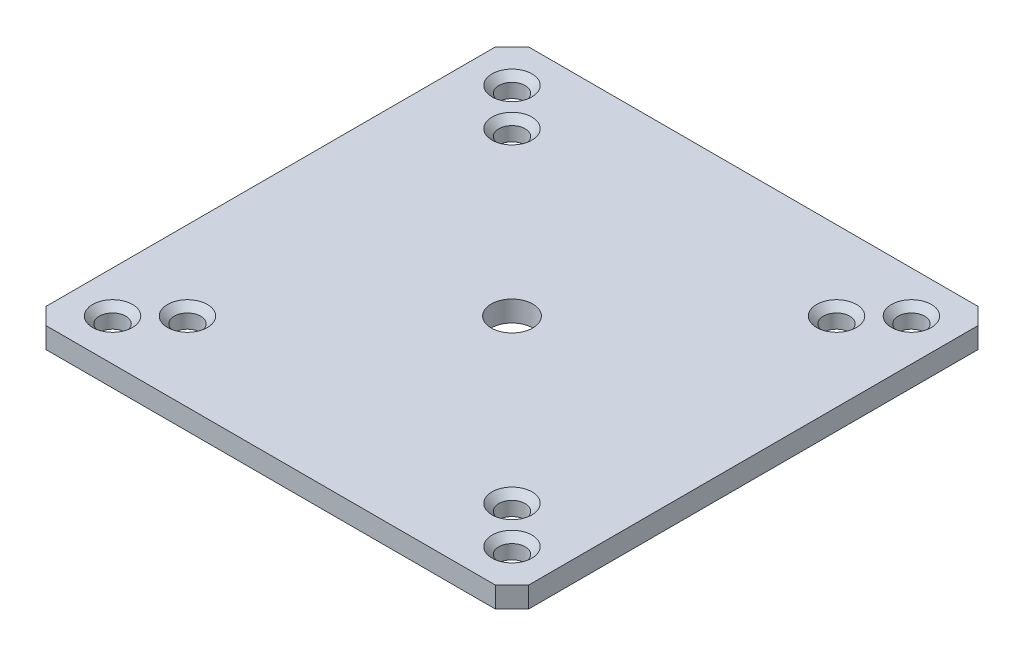
ISO-10303-21;
HEADER;
FILE_DESCRIPTION(('STEP AP214'),'2;1');
FILE_NAME('part.step','',(''),(''),'','','');
FILE_SCHEMA(('AUTOMOTIVE_DESIGN { 1 0 10303 214 1 1 1 1 }'));
ENDSEC;
DATA;
#1=APPLICATION_CONTEXT('core data for automotive mechanical design processes');
#2=APPLICATION_PROTOCOL_DEFINITION('international standard','automotive_design',2000,#1);
#3=PRODUCT_CONTEXT('',#1,'mechanical');
#4=PRODUCT('Part','Part','',(#3));
#5=PRODUCT_RELATED_PRODUCT_CATEGORY('part','',(#4));
#6=PRODUCT_DEFINITION_FORMATION('','',#4);
#7=PRODUCT_DEFINITION_CONTEXT('part definition',#1,'design');
#8=PRODUCT_DEFINITION('design','',#6,#7);
#9=PRODUCT_DEFINITION_SHAPE('','',#8);
#10=(LENGTH_UNIT() NAMED_UNIT(*) SI_UNIT(.MILLI.,.METRE.));
#11=(NAMED_UNIT(*) PLANE_ANGLE_UNIT() SI_UNIT($,.RADIAN.));
#12=(NAMED_UNIT(*) SI_UNIT($,.STERADIAN.) SOLID_ANGLE_UNIT());
#13=UNCERTAINTY_MEASURE_WITH_UNIT(LENGTH_MEASURE(1.E-05),#10,'distance_accuracy_value','');
#14=(GEOMETRIC_REPRESENTATION_CONTEXT(3) GLOBAL_UNCERTAINTY_ASSIGNED_CONTEXT((#13)) GLOBAL_UNIT_ASSIGNED_CONTEXT((#10,
#11,#12)) REPRESENTATION_CONTEXT('',''));
#15=CARTESIAN_POINT('',(0.,0.,0.));
#16=DIRECTION('',(0.,0.,1.));
#17=DIRECTION('',(1.,0.,0.));
#18=AXIS2_PLACEMENT_3D('',#15,#16,#17);
#19=CARTESIAN_POINT('',(0.,3.175,0.));
#20=DIRECTION('',(0.,1.,0.));
#21=DIRECTION('',(0.,0.,1.));
#22=AXIS2_PLACEMENT_3D('',#19,#20,#21);
#23=PLANE('',#22);
#24=CARTESIAN_POINT('',(-24.765,3.175,-24.765));
#25=DIRECTION('',(0.,1.,0.));
#26=DIRECTION('',(0.,0.,1.));
#27=AXIS2_PLACEMENT_3D('',#24,#25,#26);
#28=CIRCLE('',#27,3.048);
#29=CARTESIAN_POINT('',(-24.765,3.175,-21.717));
#30=VERTEX_POINT('',#29);
#31=EDGE_CURVE('E261',#30,#30,#28,.T.);
#32=ORIENTED_EDGE('',*,*,#31,.F.);
#33=EDGE_LOOP('',(#32));
#34=FACE_BOUND('',#33,.T.);
#35=CARTESIAN_POINT('',(24.765,3.175,-24.765));
#36=DIRECTION('',(0.,1.,0.));
#37=DIRECTION('',(0.,0.,1.));
#38=AXIS2_PLACEMENT_3D('',#35,#36,#37);
#39=CIRCLE('',#38,3.048);
#40=CARTESIAN_POINT('',(24.765,3.175,-21.717));
#41=VERTEX_POINT('',#40);
#42=EDGE_CURVE('E252',#41,#41,#39,.T.);
#43=ORIENTED_EDGE('',*,*,#42,.F.);
#44=EDGE_LOOP('',(#43));
#45=FACE_BOUND('',#44,.T.);
#46=CARTESIAN_POINT('',(-24.765,3.175,24.765));
#47=DIRECTION('',(0.,1.,0.));
#48=DIRECTION('',(0.,0.,1.));
#49=AXIS2_PLACEMENT_3D('',#46,#47,#48);
#50=CIRCLE('',#49,3.048);
#51=CARTESIAN_POINT('',(-24.765,3.175,27.813));
#52=VERTEX_POINT('',#51);
#53=EDGE_CURVE('E242',#52,#52,#50,.T.);
#54=ORIENTED_EDGE('',*,*,#53,.F.);
#55=EDGE_LOOP('',(#54));
#56=FACE_BOUND('',#55,.T.);
#57=CARTESIAN_POINT('',(24.765,3.175,24.765));
#58=DIRECTION('',(0.,1.,0.));
#59=DIRECTION('',(0.,0.,1.));
#60=AXIS2_PLACEMENT_3D('',#57,#58,#59);
#61=CIRCLE('',#60,3.048);
#62=CARTESIAN_POINT('',(24.765,3.175,27.813));
#63=VERTEX_POINT('',#62);
#64=EDGE_CURVE('E234',#63,#63,#61,.T.);
#65=ORIENTED_EDGE('',*,*,#64,.F.);
#66=EDGE_LOOP('',(#65));
#67=FACE_BOUND('',#66,.T.);
#68=CARTESIAN_POINT('',(30.48,3.175,-30.48));
#69=DIRECTION('',(0.,1.,0.));
#70=DIRECTION('',(0.,0.,1.));
#71=AXIS2_PLACEMENT_3D('',#68,#69,#70);
#72=CIRCLE('',#71,3.048);
#73=CARTESIAN_POINT('',(30.48,3.175,-27.432));
#74=VERTEX_POINT('',#73);
#75=EDGE_CURVE('E223',#74,#74,#72,.T.);
#76=ORIENTED_EDGE('',*,*,#75,.F.);
#77=EDGE_LOOP('',(#76));
#78=FACE_BOUND('',#77,.T.);
#79=CARTESIAN_POINT('',(-30.48,3.175,-30.48));
#80=DIRECTION('',(0.,1.,0.));
#81=DIRECTION('',(0.,0.,1.));
#82=AXIS2_PLACEMENT_3D('',#79,#80,#81);
#83=CIRCLE('',#82,3.048);
#84=CARTESIAN_POINT('',(-30.48,3.175,-27.432));
#85=VERTEX_POINT('',#84);
#86=EDGE_CURVE('E216',#85,#85,#83,.T.);
#87=ORIENTED_EDGE('',*,*,#86,.F.);
#88=EDGE_LOOP('',(#87));
#89=FACE_BOUND('',#88,.T.);
#90=CARTESIAN_POINT('',(-30.48,3.175,30.48));
#91=DIRECTION('',(0.,1.,0.));
#92=DIRECTION('',(0.,0.,1.));
#93=AXIS2_PLACEMENT_3D('',#90,#91,#92);
#94=CIRCLE('',#93,3.048);
#95=CARTESIAN_POINT('',(-30.48,3.175,33.528));
#96=VERTEX_POINT('',#95);
#97=EDGE_CURVE('E210',#96,#96,#94,.T.);
#98=ORIENTED_EDGE('',*,*,#97,.F.);
#99=EDGE_LOOP('',(#98));
#100=FACE_BOUND('',#99,.T.);
#101=CARTESIAN_POINT('',(30.48,3.175,30.48));
#102=DIRECTION('',(0.,1.,0.));
#103=DIRECTION('',(0.,0.,1.));
#104=AXIS2_PLACEMENT_3D('',#101,#102,#103);
#105=CIRCLE('',#104,3.048);
#106=CARTESIAN_POINT('',(30.48,3.175,33.528));
#107=VERTEX_POINT('',#106);
#108=EDGE_CURVE('E196',#107,#107,#105,.T.);
#109=ORIENTED_EDGE('',*,*,#108,.F.);
#110=EDGE_LOOP('',(#109));
#111=FACE_BOUND('',#110,.T.);
#112=DIRECTION('',(0.,0.,-1.));
#113=VECTOR('',#112,1.);
#114=CARTESIAN_POINT('',(36.83,3.175,36.83));
#115=LINE('',#114,#113);
#116=CARTESIAN_POINT('',(36.83,3.175,34.29));
#117=VERTEX_POINT('',#116);
#118=CARTESIAN_POINT('',(36.83,3.175,-34.29));
#119=VERTEX_POINT('',#118);
#120=EDGE_CURVE('E188',#117,#119,#115,.T.);
#121=ORIENTED_EDGE('',*,*,#120,.T.);
#122=DIRECTION('',(0.707106781186548,0.,0.707106781186548));
#123=VECTOR('',#122,1.);
#124=CARTESIAN_POINT('',(35.56,3.175,-35.56));
#125=LINE('',#124,#123);
#126=CARTESIAN_POINT('',(34.29,3.175,-36.83));
#127=VERTEX_POINT('',#126);
#128=EDGE_CURVE('E162',#119,#127,#125,.F.);
#129=ORIENTED_EDGE('',*,*,#128,.T.);
#130=DIRECTION('',(-1.,0.,0.));
#131=VECTOR('',#130,1.);
#132=CARTESIAN_POINT('',(36.83,3.175,-36.83));
#133=LINE('',#132,#131);
#134=CARTESIAN_POINT('',(-34.29,3.175,-36.83));
#135=VERTEX_POINT('',#134);
#136=EDGE_CURVE('E135',#127,#135,#133,.T.);
#137=ORIENTED_EDGE('',*,*,#136,.T.);
#138=DIRECTION('',(0.70710678118655,0.,-0.707106781186546));
#139=VECTOR('',#138,1.);
#140=CARTESIAN_POINT('',(-35.5599999999999,3.175,-35.5600000000001));
#141=LINE('',#140,#139);
#142=CARTESIAN_POINT('',(-36.83,3.175,-34.29));
#143=VERTEX_POINT('',#142);
#144=EDGE_CURVE('E161',#135,#143,#141,.F.);
#145=ORIENTED_EDGE('',*,*,#144,.T.);
#146=DIRECTION('',(0.,0.,1.));
#147=VECTOR('',#146,1.);
#148=CARTESIAN_POINT('',(-36.83,3.175,36.83));
#149=LINE('',#148,#147);
#150=CARTESIAN_POINT('',(-36.83,3.175,34.29));
#151=VERTEX_POINT('',#150);
#152=EDGE_CURVE('E143',#143,#151,#149,.T.);
#153=ORIENTED_EDGE('',*,*,#152,.T.);
#154=DIRECTION('',(-0.707106781186548,0.,-0.707106781186548));
#155=VECTOR('',#154,1.);
#156=CARTESIAN_POINT('',(-35.56,3.175,35.56));
#157=LINE('',#156,#155);
#158=CARTESIAN_POINT('',(-34.29,3.175,36.83));
#159=VERTEX_POINT('',#158);
#160=EDGE_CURVE('E69',#151,#159,#157,.F.);
#161=ORIENTED_EDGE('',*,*,#160,.T.);
#162=DIRECTION('',(1.,0.,0.));
#163=VECTOR('',#162,1.);
#164=CARTESIAN_POINT('',(36.83,3.175,36.83));
#165=LINE('',#164,#163);
#166=CARTESIAN_POINT('',(34.29,3.175,36.83));
#167=VERTEX_POINT('',#166);
#168=EDGE_CURVE('E145',#159,#167,#165,.T.);
#169=ORIENTED_EDGE('',*,*,#168,.T.);
#170=DIRECTION('',(-0.707106781186549,0.,0.707106781186546));
#171=VECTOR('',#170,1.);
#172=CARTESIAN_POINT('',(35.5599999999999,3.175,35.5600000000001));
#173=LINE('',#172,#171);
#174=EDGE_CURVE('E158',#167,#117,#173,.F.);
#175=ORIENTED_EDGE('',*,*,#174,.T.);
#176=EDGE_LOOP('',(#121,#129,#137,#145,#153,#161,#169,#175));
#177=FACE_BOUND('',#176,.T.);
#178=CARTESIAN_POINT('',(0.,3.175,0.));
#179=DIRECTION('',(0.,1.,0.));
#180=DIRECTION('',(0.,0.,1.));
#181=AXIS2_PLACEMENT_3D('',#178,#179,#180);
#182=CIRCLE('',#181,3.175);
#183=CARTESIAN_POINT('',(0.,3.175,3.17500000000001));
#184=VERTEX_POINT('',#183);
#185=EDGE_CURVE('E179',#184,#184,#182,.T.);
#186=ORIENTED_EDGE('',*,*,#185,.F.);
#187=EDGE_LOOP('',(#186));
#188=FACE_BOUND('',#187,.T.);
#189=ADVANCED_FACE('F50',(#34,#45,#56,#67,#78,#89,#100,#111,#177,#188),#23,.T.);
#190=CARTESIAN_POINT('',(0.,0.,0.));
#191=DIRECTION('',(0.,1.,0.));
#192=DIRECTION('',(0.,0.,1.));
#193=AXIS2_PLACEMENT_3D('',#190,#191,#192);
#194=PLANE('',#193);
#195=CARTESIAN_POINT('',(-24.765,0.,-24.765));
#196=DIRECTION('',(0.,1.,0.));
#197=DIRECTION('',(0.,0.,1.));
#198=AXIS2_PLACEMENT_3D('',#195,#196,#197);
#199=CIRCLE('',#198,2.0193);
#200=CARTESIAN_POINT('',(-24.765,0.,-22.7457));
#201=VERTEX_POINT('',#200);
#202=EDGE_CURVE('E254',#201,#201,#199,.T.);
#203=ORIENTED_EDGE('',*,*,#202,.T.);
#204=EDGE_LOOP('',(#203));
#205=FACE_BOUND('',#204,.T.);
#206=CARTESIAN_POINT('',(24.765,0.,-24.765));
#207=DIRECTION('',(0.,1.,0.));
#208=DIRECTION('',(0.,0.,1.));
#209=AXIS2_PLACEMENT_3D('',#206,#207,#208);
#210=CIRCLE('',#209,2.0193);
#211=CARTESIAN_POINT('',(24.765,0.,-22.7457));
#212=VERTEX_POINT('',#211);
#213=EDGE_CURVE('E248',#212,#212,#210,.T.);
#214=ORIENTED_EDGE('',*,*,#213,.T.);
#215=EDGE_LOOP('',(#214));
#216=FACE_BOUND('',#215,.T.);
#217=CARTESIAN_POINT('',(-24.765,0.,24.765));
#218=DIRECTION('',(0.,1.,0.));
#219=DIRECTION('',(0.,0.,1.));
#220=AXIS2_PLACEMENT_3D('',#217,#218,#219);
#221=CIRCLE('',#220,2.0193);
#222=CARTESIAN_POINT('',(-24.765,0.,26.7843));
#223=VERTEX_POINT('',#222);
#224=EDGE_CURVE('E240',#223,#223,#221,.T.);
#225=ORIENTED_EDGE('',*,*,#224,.T.);
#226=EDGE_LOOP('',(#225));
#227=FACE_BOUND('',#226,.T.);
#228=CARTESIAN_POINT('',(24.765,0.,24.765));
#229=DIRECTION('',(0.,1.,0.));
#230=DIRECTION('',(0.,0.,1.));
#231=AXIS2_PLACEMENT_3D('',#228,#229,#230);
#232=CIRCLE('',#231,2.0193);
#233=CARTESIAN_POINT('',(24.765,0.,26.7843));
#234=VERTEX_POINT('',#233);
#235=EDGE_CURVE('E227',#234,#234,#232,.T.);
#236=ORIENTED_EDGE('',*,*,#235,.T.);
#237=EDGE_LOOP('',(#236));
#238=FACE_BOUND('',#237,.T.);
#239=CARTESIAN_POINT('',(30.48,0.,-30.48));
#240=DIRECTION('',(0.,1.,0.));
#241=DIRECTION('',(0.,0.,1.));
#242=AXIS2_PLACEMENT_3D('',#239,#240,#241);
#243=CIRCLE('',#242,2.0193);
#244=CARTESIAN_POINT('',(30.48,0.,-28.4607));
#245=VERTEX_POINT('',#244);
#246=EDGE_CURVE('E218',#245,#245,#243,.T.);
#247=ORIENTED_EDGE('',*,*,#246,.T.);
#248=EDGE_LOOP('',(#247));
#249=FACE_BOUND('',#248,.T.);
#250=CARTESIAN_POINT('',(-30.48,0.,-30.48));
#251=DIRECTION('',(0.,1.,0.));
#252=DIRECTION('',(0.,0.,1.));
#253=AXIS2_PLACEMENT_3D('',#250,#251,#252);
#254=CIRCLE('',#253,2.0193);
#255=CARTESIAN_POINT('',(-30.48,0.,-28.4607));
#256=VERTEX_POINT('',#255);
#257=EDGE_CURVE('E209',#256,#256,#254,.T.);
#258=ORIENTED_EDGE('',*,*,#257,.T.);
#259=EDGE_LOOP('',(#258));
#260=FACE_BOUND('',#259,.T.);
#261=CARTESIAN_POINT('',(-30.48,0.,30.48));
#262=DIRECTION('',(0.,1.,0.));
#263=DIRECTION('',(0.,0.,1.));
#264=AXIS2_PLACEMENT_3D('',#261,#262,#263);
#265=CIRCLE('',#264,2.0193);
#266=CARTESIAN_POINT('',(-30.48,0.,32.4993));
#267=VERTEX_POINT('',#266);
#268=EDGE_CURVE('E203',#267,#267,#265,.T.);
#269=ORIENTED_EDGE('',*,*,#268,.T.);
#270=EDGE_LOOP('',(#269));
#271=FACE_BOUND('',#270,.T.);
#272=CARTESIAN_POINT('',(30.48,0.,30.48));
#273=DIRECTION('',(0.,1.,0.));
#274=DIRECTION('',(0.,0.,1.));
#275=AXIS2_PLACEMENT_3D('',#272,#273,#274);
#276=CIRCLE('',#275,2.0193);
#277=CARTESIAN_POINT('',(30.48,0.,32.4993));
#278=VERTEX_POINT('',#277);
#279=EDGE_CURVE('E193',#278,#278,#276,.T.);
#280=ORIENTED_EDGE('',*,*,#279,.T.);
#281=EDGE_LOOP('',(#280));
#282=FACE_BOUND('',#281,.T.);
#283=DIRECTION('',(-1.,0.,0.));
#284=VECTOR('',#283,1.);
#285=CARTESIAN_POINT('',(36.83,0.,-36.83));
#286=LINE('',#285,#284);
#287=CARTESIAN_POINT('',(34.29,0.,-36.83));
#288=VERTEX_POINT('',#287);
#289=CARTESIAN_POINT('',(-34.29,0.,-36.83));
#290=VERTEX_POINT('',#289);
#291=EDGE_CURVE('E133',#288,#290,#286,.T.);
#292=ORIENTED_EDGE('',*,*,#291,.F.);
#293=DIRECTION('',(-0.707106781186548,0.,-0.707106781186548));
#294=VECTOR('',#293,1.);
#295=CARTESIAN_POINT('',(34.29,0.,-36.83));
#296=LINE('',#295,#294);
#297=CARTESIAN_POINT('',(36.83,0.,-34.29));
#298=VERTEX_POINT('',#297);
#299=EDGE_CURVE('E111',#288,#298,#296,.F.);
#300=ORIENTED_EDGE('',*,*,#299,.T.);
#301=DIRECTION('',(0.,0.,-1.));
#302=VECTOR('',#301,1.);
#303=CARTESIAN_POINT('',(36.83,0.,36.83));
#304=LINE('',#303,#302);
#305=CARTESIAN_POINT('',(36.83,0.,34.29));
#306=VERTEX_POINT('',#305);
#307=EDGE_CURVE('E142',#306,#298,#304,.T.);
#308=ORIENTED_EDGE('',*,*,#307,.F.);
#309=DIRECTION('',(0.707106781186549,0.,-0.707106781186546));
#310=VECTOR('',#309,1.);
#311=CARTESIAN_POINT('',(36.83,0.,34.29));
#312=LINE('',#311,#310);
#313=CARTESIAN_POINT('',(34.29,0.,36.83));
#314=VERTEX_POINT('',#313);
#315=EDGE_CURVE('E131',#306,#314,#312,.F.);
#316=ORIENTED_EDGE('',*,*,#315,.T.);
#317=DIRECTION('',(1.,0.,0.));
#318=VECTOR('',#317,1.);
#319=CARTESIAN_POINT('',(36.83,0.,36.83));
#320=LINE('',#319,#318);
#321=CARTESIAN_POINT('',(-34.29,0.,36.83));
#322=VERTEX_POINT('',#321);
#323=EDGE_CURVE('E148',#322,#314,#320,.T.);
#324=ORIENTED_EDGE('',*,*,#323,.F.);
#325=DIRECTION('',(0.707106781186548,0.,0.707106781186548));
#326=VECTOR('',#325,1.);
#327=CARTESIAN_POINT('',(-34.29,0.,36.83));
#328=LINE('',#327,#326);
#329=CARTESIAN_POINT('',(-36.83,0.,34.29));
#330=VERTEX_POINT('',#329);
#331=EDGE_CURVE('E155',#322,#330,#328,.F.);
#332=ORIENTED_EDGE('',*,*,#331,.T.);
#333=DIRECTION('',(0.,0.,1.));
#334=VECTOR('',#333,1.);
#335=CARTESIAN_POINT('',(-36.83,0.,36.83));
#336=LINE('',#335,#334);
#337=CARTESIAN_POINT('',(-36.83,0.,-34.29));
#338=VERTEX_POINT('',#337);
#339=EDGE_CURVE('E175',#338,#330,#336,.T.);
#340=ORIENTED_EDGE('',*,*,#339,.F.);
#341=DIRECTION('',(-0.70710678118655,0.,0.707106781186546));
#342=VECTOR('',#341,1.);
#343=CARTESIAN_POINT('',(-36.83,0.,-34.29));
#344=LINE('',#343,#342);
#345=EDGE_CURVE('E122',#338,#290,#344,.F.);
#346=ORIENTED_EDGE('',*,*,#345,.T.);
#347=EDGE_LOOP('',(#292,#300,#308,#316,#324,#332,#340,#346));
#348=FACE_BOUND('',#347,.T.);
#349=CARTESIAN_POINT('',(0.,0.,0.));
#350=DIRECTION('',(0.,1.,0.));
#351=DIRECTION('',(0.,0.,1.));
#352=AXIS2_PLACEMENT_3D('',#349,#350,#351);
#353=CIRCLE('',#352,3.175);
#354=CARTESIAN_POINT('',(0.,0.,3.17500000000001));
#355=VERTEX_POINT('',#354);
#356=EDGE_CURVE('E185',#355,#355,#353,.T.);
#357=ORIENTED_EDGE('',*,*,#356,.T.);
#358=EDGE_LOOP('',(#357));
#359=FACE_BOUND('',#358,.T.);
#360=ADVANCED_FACE('F136',(#205,#216,#227,#238,#249,#260,#271,#282,#348,#359),#194,.F.);
#361=CARTESIAN_POINT('',(-36.83,3.175,36.83));
#362=DIRECTION('',(1.,0.,0.));
#363=DIRECTION('',(0.,0.,-1.));
#364=AXIS2_PLACEMENT_3D('',#361,#362,#363);
#365=PLANE('',#364);
#366=ORIENTED_EDGE('',*,*,#152,.F.);
#367=DIRECTION('',(0.,-1.,0.));
#368=VECTOR('',#367,1.);
#369=CARTESIAN_POINT('',(-36.83,3.175,-34.29));
#370=LINE('',#369,#368);
#371=EDGE_CURVE('E170',#143,#338,#370,.T.);
#372=ORIENTED_EDGE('',*,*,#371,.T.);
#373=ORIENTED_EDGE('',*,*,#339,.T.);
#374=DIRECTION('',(0.,1.,0.));
#375=VECTOR('',#374,1.);
#376=CARTESIAN_POINT('',(-36.83,3.175,34.29));
#377=LINE('',#376,#375);
#378=EDGE_CURVE('E164',#330,#151,#377,.T.);
#379=ORIENTED_EDGE('',*,*,#378,.T.);
#380=EDGE_LOOP('',(#366,#372,#373,#379));
#381=FACE_BOUND('',#380,.T.);
#382=ADVANCED_FACE('F172',(#381),#365,.F.);
#383=CARTESIAN_POINT('',(36.83,3.175,36.83));
#384=DIRECTION('',(0.,0.,-1.));
#385=DIRECTION('',(-1.,0.,0.));
#386=AXIS2_PLACEMENT_3D('',#383,#384,#385);
#387=PLANE('',#386);
#388=ORIENTED_EDGE('',*,*,#168,.F.);
#389=DIRECTION('',(0.,-1.,0.));
#390=VECTOR('',#389,1.);
#391=CARTESIAN_POINT('',(-34.29,3.175,36.83));
#392=LINE('',#391,#390);
#393=EDGE_CURVE('E11',#159,#322,#392,.T.);
#394=ORIENTED_EDGE('',*,*,#393,.T.);
#395=ORIENTED_EDGE('',*,*,#323,.T.);
#396=DIRECTION('',(0.,1.,0.));
#397=VECTOR('',#396,1.);
#398=CARTESIAN_POINT('',(34.29,3.175,36.83));
#399=LINE('',#398,#397);
#400=EDGE_CURVE('E57',#314,#167,#399,.T.);
#401=ORIENTED_EDGE('',*,*,#400,.T.);
#402=EDGE_LOOP('',(#388,#394,#395,#401));
#403=FACE_BOUND('',#402,.T.);
#404=ADVANCED_FACE('F300',(#403),#387,.F.);
#405=CARTESIAN_POINT('',(36.83,3.175,36.83));
#406=DIRECTION('',(-1.,0.,0.));
#407=DIRECTION('',(0.,0.,1.));
#408=AXIS2_PLACEMENT_3D('',#405,#406,#407);
#409=PLANE('',#408);
#410=ORIENTED_EDGE('',*,*,#307,.T.);
#411=DIRECTION('',(0.,1.,0.));
#412=VECTOR('',#411,1.);
#413=CARTESIAN_POINT('',(36.83,3.175,-34.29));
#414=LINE('',#413,#412);
#415=EDGE_CURVE('E120',#298,#119,#414,.T.);
#416=ORIENTED_EDGE('',*,*,#415,.T.);
#417=ORIENTED_EDGE('',*,*,#120,.F.);
#418=DIRECTION('',(0.,-1.,0.));
#419=VECTOR('',#418,1.);
#420=CARTESIAN_POINT('',(36.83,3.175,34.29));
#421=LINE('',#420,#419);
#422=EDGE_CURVE('E124',#117,#306,#421,.T.);
#423=ORIENTED_EDGE('',*,*,#422,.T.);
#424=EDGE_LOOP('',(#410,#416,#417,#423));
#425=FACE_BOUND('',#424,.T.);
#426=ADVANCED_FACE('F302',(#425),#409,.F.);
#427=CARTESIAN_POINT('',(36.83,3.175,-36.83));
#428=DIRECTION('',(0.,0.,1.));
#429=DIRECTION('',(1.,0.,0.));
#430=AXIS2_PLACEMENT_3D('',#427,#428,#429);
#431=PLANE('',#430);
#432=ORIENTED_EDGE('',*,*,#136,.F.);
#433=DIRECTION('',(0.,-1.,0.));
#434=VECTOR('',#433,1.);
#435=CARTESIAN_POINT('',(34.29,3.175,-36.83));
#436=LINE('',#435,#434);
#437=EDGE_CURVE('E117',#127,#288,#436,.T.);
#438=ORIENTED_EDGE('',*,*,#437,.T.);
#439=ORIENTED_EDGE('',*,*,#291,.T.);
#440=DIRECTION('',(0.,1.,0.));
#441=VECTOR('',#440,1.);
#442=CARTESIAN_POINT('',(-34.29,3.175,-36.83));
#443=LINE('',#442,#441);
#444=EDGE_CURVE('E138',#290,#135,#443,.T.);
#445=ORIENTED_EDGE('',*,*,#444,.T.);
#446=EDGE_LOOP('',(#432,#438,#439,#445));
#447=FACE_BOUND('',#446,.T.);
#448=ADVANCED_FACE('F128',(#447),#431,.F.);
#449=CARTESIAN_POINT('',(0.,3.175,0.));
#450=DIRECTION('',(0.,-1.,0.));
#451=DIRECTION('',(0.,0.,-1.));
#452=AXIS2_PLACEMENT_3D('',#449,#450,#451);
#453=CYLINDRICAL_SURFACE('',#452,3.175);
#454=ORIENTED_EDGE('',*,*,#185,.T.);
#455=EDGE_LOOP('',(#454));
#456=FACE_BOUND('',#455,.T.);
#457=ORIENTED_EDGE('',*,*,#356,.F.);
#458=EDGE_LOOP('',(#457));
#459=FACE_BOUND('',#458,.T.);
#460=ADVANCED_FACE('F290',(#456,#459),#453,.F.);
#461=CARTESIAN_POINT('',(34.29,3.175,-36.83));
#462=DIRECTION('',(-0.707106781186548,0.,0.707106781186548));
#463=DIRECTION('',(0.,-1.,0.));
#464=AXIS2_PLACEMENT_3D('',#461,#462,#463);
#465=PLANE('',#464);
#466=ORIENTED_EDGE('',*,*,#128,.F.);
#467=ORIENTED_EDGE('',*,*,#415,.F.);
#468=ORIENTED_EDGE('',*,*,#299,.F.);
#469=ORIENTED_EDGE('',*,*,#437,.F.);
#470=EDGE_LOOP('',(#466,#467,#468,#469));
#471=FACE_BOUND('',#470,.T.);
#472=ADVANCED_FACE('F119',(#471),#465,.F.);
#473=CARTESIAN_POINT('',(-36.83,3.175,-34.29));
#474=DIRECTION('',(0.707106781186546,0.,0.70710678118655));
#475=DIRECTION('',(0.,-1.,0.));
#476=AXIS2_PLACEMENT_3D('',#473,#474,#475);
#477=PLANE('',#476);
#478=ORIENTED_EDGE('',*,*,#144,.F.);
#479=ORIENTED_EDGE('',*,*,#444,.F.);
#480=ORIENTED_EDGE('',*,*,#345,.F.);
#481=ORIENTED_EDGE('',*,*,#371,.F.);
#482=EDGE_LOOP('',(#478,#479,#480,#481));
#483=FACE_BOUND('',#482,.T.);
#484=ADVANCED_FACE('F320',(#483),#477,.F.);
#485=CARTESIAN_POINT('',(-34.29,3.175,36.83));
#486=DIRECTION('',(0.707106781186547,0.,-0.707106781186547));
#487=DIRECTION('',(0.,-1.,0.));
#488=AXIS2_PLACEMENT_3D('',#485,#486,#487);
#489=PLANE('',#488);
#490=ORIENTED_EDGE('',*,*,#160,.F.);
#491=ORIENTED_EDGE('',*,*,#378,.F.);
#492=ORIENTED_EDGE('',*,*,#331,.F.);
#493=ORIENTED_EDGE('',*,*,#393,.F.);
#494=EDGE_LOOP('',(#490,#491,#492,#493));
#495=FACE_BOUND('',#494,.T.);
#496=ADVANCED_FACE('F325',(#495),#489,.F.);
#497=CARTESIAN_POINT('',(36.83,3.175,34.29));
#498=DIRECTION('',(-0.707106781186546,0.,-0.707106781186549));
#499=DIRECTION('',(0.,-1.,0.));
#500=AXIS2_PLACEMENT_3D('',#497,#498,#499);
#501=PLANE('',#500);
#502=ORIENTED_EDGE('',*,*,#174,.F.);
#503=ORIENTED_EDGE('',*,*,#400,.F.);
#504=ORIENTED_EDGE('',*,*,#315,.F.);
#505=ORIENTED_EDGE('',*,*,#422,.F.);
#506=EDGE_LOOP('',(#502,#503,#504,#505));
#507=FACE_BOUND('',#506,.T.);
#508=ADVANCED_FACE('F49',(#507),#501,.F.);
#509=CARTESIAN_POINT('',(30.48,3.175,30.48));
#510=DIRECTION('',(0.,1.,0.));
#511=DIRECTION('',(0.,0.,1.));
#512=AXIS2_PLACEMENT_3D('',#509,#510,#511);
#513=CYLINDRICAL_SURFACE('',#512,2.0193);
#514=ORIENTED_EDGE('',*,*,#279,.F.);
#515=EDGE_LOOP('',(#514));
#516=FACE_BOUND('',#515,.T.);
#517=CARTESIAN_POINT('',(30.48,2.1463,30.48));
#518=DIRECTION('',(0.,1.,0.));
#519=DIRECTION('',(0.,0.,1.));
#520=AXIS2_PLACEMENT_3D('',#517,#518,#519);
#521=CIRCLE('',#520,2.0193);
#522=CARTESIAN_POINT('',(30.48,2.1463,32.4993));
#523=VERTEX_POINT('',#522);
#524=EDGE_CURVE('E192',#523,#523,#521,.T.);
#525=ORIENTED_EDGE('',*,*,#524,.T.);
#526=EDGE_LOOP('',(#525));
#527=FACE_BOUND('',#526,.T.);
#528=ADVANCED_FACE('F329',(#516,#527),#513,.F.);
#529=CARTESIAN_POINT('',(30.48,3.175,30.48));
#530=DIRECTION('',(0.,1.,0.));
#531=DIRECTION('',(0.,0.,1.));
#532=AXIS2_PLACEMENT_3D('',#529,#530,#531);
#533=CONICAL_SURFACE('',#532,3.048,0.785398163397448);
#534=ORIENTED_EDGE('',*,*,#524,.F.);
#535=EDGE_LOOP('',(#534));
#536=FACE_BOUND('',#535,.T.);
#537=ORIENTED_EDGE('',*,*,#108,.T.);
#538=EDGE_LOOP('',(#537));
#539=FACE_BOUND('',#538,.T.);
#540=ADVANCED_FACE('F340',(#536,#539),#533,.F.);
#541=CARTESIAN_POINT('',(-30.48,3.175,30.48));
#542=DIRECTION('',(0.,1.,0.));
#543=DIRECTION('',(0.,0.,1.));
#544=AXIS2_PLACEMENT_3D('',#541,#542,#543);
#545=CYLINDRICAL_SURFACE('',#544,2.0193);
#546=ORIENTED_EDGE('',*,*,#268,.F.);
#547=EDGE_LOOP('',(#546));
#548=FACE_BOUND('',#547,.T.);
#549=CARTESIAN_POINT('',(-30.48,2.1463,30.48));
#550=DIRECTION('',(0.,1.,0.));
#551=DIRECTION('',(0.,0.,1.));
#552=AXIS2_PLACEMENT_3D('',#549,#550,#551);
#553=CIRCLE('',#552,2.0193);
#554=CARTESIAN_POINT('',(-30.48,2.1463,32.4993));
#555=VERTEX_POINT('',#554);
#556=EDGE_CURVE('E204',#555,#555,#553,.T.);
#557=ORIENTED_EDGE('',*,*,#556,.T.);
#558=EDGE_LOOP('',(#557));
#559=FACE_BOUND('',#558,.T.);
#560=ADVANCED_FACE('F350',(#548,#559),#545,.F.);
#561=CARTESIAN_POINT('',(-30.48,3.175,30.48));
#562=DIRECTION('',(0.,1.,0.));
#563=DIRECTION('',(0.,0.,1.));
#564=AXIS2_PLACEMENT_3D('',#561,#562,#563);
#565=CONICAL_SURFACE('',#564,3.048,0.785398163397448);
#566=ORIENTED_EDGE('',*,*,#556,.F.);
#567=EDGE_LOOP('',(#566));
#568=FACE_BOUND('',#567,.T.);
#569=ORIENTED_EDGE('',*,*,#97,.T.);
#570=EDGE_LOOP('',(#569));
#571=FACE_BOUND('',#570,.T.);
#572=ADVANCED_FACE('F355',(#568,#571),#565,.F.);
#573=CARTESIAN_POINT('',(-30.48,3.175,-30.48));
#574=DIRECTION('',(0.,1.,0.));
#575=DIRECTION('',(0.,0.,1.));
#576=AXIS2_PLACEMENT_3D('',#573,#574,#575);
#577=CYLINDRICAL_SURFACE('',#576,2.0193);
#578=ORIENTED_EDGE('',*,*,#257,.F.);
#579=EDGE_LOOP('',(#578));
#580=FACE_BOUND('',#579,.T.);
#581=CARTESIAN_POINT('',(-30.48,2.1463,-30.48));
#582=DIRECTION('',(0.,1.,0.));
#583=DIRECTION('',(0.,0.,1.));
#584=AXIS2_PLACEMENT_3D('',#581,#582,#583);
#585=CIRCLE('',#584,2.0193);
#586=CARTESIAN_POINT('',(-30.48,2.1463,-28.4607));
#587=VERTEX_POINT('',#586);
#588=EDGE_CURVE('E213',#587,#587,#585,.T.);
#589=ORIENTED_EDGE('',*,*,#588,.T.);
#590=EDGE_LOOP('',(#589));
#591=FACE_BOUND('',#590,.T.);
#592=ADVANCED_FACE('F356',(#580,#591),#577,.F.);
#593=CARTESIAN_POINT('',(-30.48,3.175,-30.48));
#594=DIRECTION('',(0.,1.,0.));
#595=DIRECTION('',(0.,0.,1.));
#596=AXIS2_PLACEMENT_3D('',#593,#594,#595);
#597=CONICAL_SURFACE('',#596,3.048,0.785398163397448);
#598=ORIENTED_EDGE('',*,*,#588,.F.);
#599=EDGE_LOOP('',(#598));
#600=FACE_BOUND('',#599,.T.);
#601=ORIENTED_EDGE('',*,*,#86,.T.);
#602=EDGE_LOOP('',(#601));
#603=FACE_BOUND('',#602,.T.);
#604=ADVANCED_FACE('F362',(#600,#603),#597,.F.);
#605=CARTESIAN_POINT('',(30.48,3.175,-30.48));
#606=DIRECTION('',(0.,1.,0.));
#607=DIRECTION('',(0.,0.,1.));
#608=AXIS2_PLACEMENT_3D('',#605,#606,#607);
#609=CYLINDRICAL_SURFACE('',#608,2.0193);
#610=ORIENTED_EDGE('',*,*,#246,.F.);
#611=EDGE_LOOP('',(#610));
#612=FACE_BOUND('',#611,.T.);
#613=CARTESIAN_POINT('',(30.48,2.1463,-30.48));
#614=DIRECTION('',(0.,1.,0.));
#615=DIRECTION('',(0.,0.,1.));
#616=AXIS2_PLACEMENT_3D('',#613,#614,#615);
#617=CIRCLE('',#616,2.0193);
#618=CARTESIAN_POINT('',(30.48,2.1463,-28.4607));
#619=VERTEX_POINT('',#618);
#620=EDGE_CURVE('E225',#619,#619,#617,.T.);
#621=ORIENTED_EDGE('',*,*,#620,.T.);
#622=EDGE_LOOP('',(#621));
#623=FACE_BOUND('',#622,.T.);
#624=ADVANCED_FACE('F368',(#612,#623),#609,.F.);
#625=CARTESIAN_POINT('',(30.48,3.175,-30.48));
#626=DIRECTION('',(0.,1.,0.));
#627=DIRECTION('',(0.,0.,1.));
#628=AXIS2_PLACEMENT_3D('',#625,#626,#627);
#629=CONICAL_SURFACE('',#628,3.048,0.785398163397448);
#630=ORIENTED_EDGE('',*,*,#620,.F.);
#631=EDGE_LOOP('',(#630));
#632=FACE_BOUND('',#631,.T.);
#633=ORIENTED_EDGE('',*,*,#75,.T.);
#634=EDGE_LOOP('',(#633));
#635=FACE_BOUND('',#634,.T.);
#636=ADVANCED_FACE('F367',(#632,#635),#629,.F.);
#637=CARTESIAN_POINT('',(24.765,3.175,24.765));
#638=DIRECTION('',(0.,1.,0.));
#639=DIRECTION('',(0.,0.,1.));
#640=AXIS2_PLACEMENT_3D('',#637,#638,#639);
#641=CYLINDRICAL_SURFACE('',#640,2.01929999999999);
#642=ORIENTED_EDGE('',*,*,#235,.F.);
#643=EDGE_LOOP('',(#642));
#644=FACE_BOUND('',#643,.T.);
#645=CARTESIAN_POINT('',(24.765,2.14629999999999,24.765));
#646=DIRECTION('',(0.,1.,0.));
#647=DIRECTION('',(0.,0.,1.));
#648=AXIS2_PLACEMENT_3D('',#645,#646,#647);
#649=CIRCLE('',#648,2.01929999999999);
#650=CARTESIAN_POINT('',(24.765,2.14629999999999,26.7843));
#651=VERTEX_POINT('',#650);
#652=EDGE_CURVE('E233',#651,#651,#649,.T.);
#653=ORIENTED_EDGE('',*,*,#652,.T.);
#654=EDGE_LOOP('',(#653));
#655=FACE_BOUND('',#654,.T.);
#656=ADVANCED_FACE('F373',(#644,#655),#641,.F.);
#657=CARTESIAN_POINT('',(24.765,3.175,24.765));
#658=DIRECTION('',(0.,1.,0.));
#659=DIRECTION('',(0.,0.,1.));
#660=AXIS2_PLACEMENT_3D('',#657,#658,#659);
#661=CONICAL_SURFACE('',#660,3.048,0.785398163397449);
#662=ORIENTED_EDGE('',*,*,#652,.F.);
#663=EDGE_LOOP('',(#662));
#664=FACE_BOUND('',#663,.T.);
#665=ORIENTED_EDGE('',*,*,#64,.T.);
#666=EDGE_LOOP('',(#665));
#667=FACE_BOUND('',#666,.T.);
#668=ADVANCED_FACE('F380',(#664,#667),#661,.F.);
#669=CARTESIAN_POINT('',(-24.765,3.175,24.765));
#670=DIRECTION('',(0.,1.,0.));
#671=DIRECTION('',(0.,0.,1.));
#672=AXIS2_PLACEMENT_3D('',#669,#670,#671);
#673=CYLINDRICAL_SURFACE('',#672,2.01929999999999);
#674=ORIENTED_EDGE('',*,*,#224,.F.);
#675=EDGE_LOOP('',(#674));
#676=FACE_BOUND('',#675,.T.);
#677=CARTESIAN_POINT('',(-24.765,2.14629999999999,24.765));
#678=DIRECTION('',(0.,1.,0.));
#679=DIRECTION('',(0.,0.,1.));
#680=AXIS2_PLACEMENT_3D('',#677,#678,#679);
#681=CIRCLE('',#680,2.01929999999999);
#682=CARTESIAN_POINT('',(-24.765,2.14629999999999,26.7843));
#683=VERTEX_POINT('',#682);
#684=EDGE_CURVE('E238',#683,#683,#681,.T.);
#685=ORIENTED_EDGE('',*,*,#684,.T.);
#686=EDGE_LOOP('',(#685));
#687=FACE_BOUND('',#686,.T.);
#688=ADVANCED_FACE('F381',(#676,#687),#673,.F.);
#689=CARTESIAN_POINT('',(-24.765,3.175,24.765));
#690=DIRECTION('',(0.,1.,0.));
#691=DIRECTION('',(0.,0.,1.));
#692=AXIS2_PLACEMENT_3D('',#689,#690,#691);
#693=CONICAL_SURFACE('',#692,3.048,0.785398163397449);
#694=ORIENTED_EDGE('',*,*,#684,.F.);
#695=EDGE_LOOP('',(#694));
#696=FACE_BOUND('',#695,.T.);
#697=ORIENTED_EDGE('',*,*,#53,.T.);
#698=EDGE_LOOP('',(#697));
#699=FACE_BOUND('',#698,.T.);
#700=ADVANCED_FACE('F384',(#696,#699),#693,.F.);
#701=CARTESIAN_POINT('',(24.765,3.175,-24.765));
#702=DIRECTION('',(0.,1.,0.));
#703=DIRECTION('',(0.,0.,1.));
#704=AXIS2_PLACEMENT_3D('',#701,#702,#703);
#705=CYLINDRICAL_SURFACE('',#704,2.01929999999999);
#706=ORIENTED_EDGE('',*,*,#213,.F.);
#707=EDGE_LOOP('',(#706));
#708=FACE_BOUND('',#707,.T.);
#709=CARTESIAN_POINT('',(24.765,2.14629999999999,-24.765));
#710=DIRECTION('',(0.,1.,0.));
#711=DIRECTION('',(0.,0.,1.));
#712=AXIS2_PLACEMENT_3D('',#709,#710,#711);
#713=CIRCLE('',#712,2.01929999999999);
#714=CARTESIAN_POINT('',(24.765,2.14629999999999,-22.7457));
#715=VERTEX_POINT('',#714);
#716=EDGE_CURVE('E249',#715,#715,#713,.T.);
#717=ORIENTED_EDGE('',*,*,#716,.T.);
#718=EDGE_LOOP('',(#717));
#719=FACE_BOUND('',#718,.T.);
#720=ADVANCED_FACE('F386',(#708,#719),#705,.F.);
#721=CARTESIAN_POINT('',(24.765,3.175,-24.765));
#722=DIRECTION('',(0.,1.,0.));
#723=DIRECTION('',(0.,0.,1.));
#724=AXIS2_PLACEMENT_3D('',#721,#722,#723);
#725=CONICAL_SURFACE('',#724,3.048,0.785398163397449);
#726=ORIENTED_EDGE('',*,*,#716,.F.);
#727=EDGE_LOOP('',(#726));
#728=FACE_BOUND('',#727,.T.);
#729=ORIENTED_EDGE('',*,*,#42,.T.);
#730=EDGE_LOOP('',(#729));
#731=FACE_BOUND('',#730,.T.);
#732=ADVANCED_FACE('F392',(#728,#731),#725,.F.);
#733=CARTESIAN_POINT('',(-24.765,3.175,-24.765));
#734=DIRECTION('',(0.,1.,0.));
#735=DIRECTION('',(0.,0.,1.));
#736=AXIS2_PLACEMENT_3D('',#733,#734,#735);
#737=CYLINDRICAL_SURFACE('',#736,2.01929999999999);
#738=ORIENTED_EDGE('',*,*,#202,.F.);
#739=EDGE_LOOP('',(#738));
#740=FACE_BOUND('',#739,.T.);
#741=CARTESIAN_POINT('',(-24.765,2.14629999999999,-24.765));
#742=DIRECTION('',(0.,1.,0.));
#743=DIRECTION('',(0.,0.,1.));
#744=AXIS2_PLACEMENT_3D('',#741,#742,#743);
#745=CIRCLE('',#744,2.01929999999999);
#746=CARTESIAN_POINT('',(-24.765,2.14629999999999,-22.7457));
#747=VERTEX_POINT('',#746);
#748=EDGE_CURVE('E256',#747,#747,#745,.T.);
#749=ORIENTED_EDGE('',*,*,#748,.T.);
#750=EDGE_LOOP('',(#749));
#751=FACE_BOUND('',#750,.T.);
#752=ADVANCED_FACE('F400',(#740,#751),#737,.F.);
#753=CARTESIAN_POINT('',(-24.765,3.175,-24.765));
#754=DIRECTION('',(0.,1.,0.));
#755=DIRECTION('',(0.,0.,1.));
#756=AXIS2_PLACEMENT_3D('',#753,#754,#755);
#757=CONICAL_SURFACE('',#756,3.048,0.785398163397449);
#758=ORIENTED_EDGE('',*,*,#748,.F.);
#759=EDGE_LOOP('',(#758));
#760=FACE_BOUND('',#759,.T.);
#761=ORIENTED_EDGE('',*,*,#31,.T.);
#762=EDGE_LOOP('',(#761));
#763=FACE_BOUND('',#762,.T.);
#764=ADVANCED_FACE('F264',(#760,#763),#757,.F.);
#765=CLOSED_SHELL('',(#189,#360,#382,#404,#426,#448,#460,#472,#484,#496,#508,#528,#540,#560,
#572,#592,#604,#624,#636,#656,#668,#688,#700,#720,#732,#752,#764));
#766=MANIFOLD_SOLID_BREP('B2',#765);
#767=ADVANCED_BREP_SHAPE_REPRESENTATION('',(#18,#766),#14);
#768=SHAPE_DEFINITION_REPRESENTATION(#9,#767);
ENDSEC;
END-ISO-10303-21;
